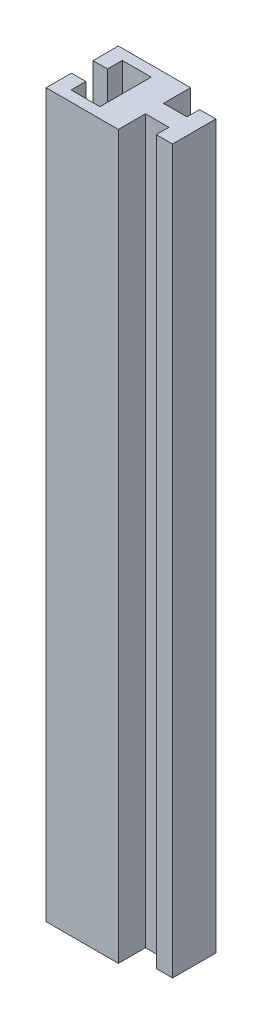
ISO-10303-21;
HEADER;
FILE_DESCRIPTION(('STEP AP214'),'2;1');
FILE_NAME('part.step','',(''),(''),'','','');
FILE_SCHEMA(('AUTOMOTIVE_DESIGN { 1 0 10303 214 1 1 1 1 }'));
ENDSEC;
DATA;
#1=APPLICATION_CONTEXT('core data for automotive mechanical design processes');
#2=APPLICATION_PROTOCOL_DEFINITION('international standard','automotive_design',2000,#1);
#3=PRODUCT_CONTEXT('',#1,'mechanical');
#4=PRODUCT('Part','Part','',(#3));
#5=PRODUCT_RELATED_PRODUCT_CATEGORY('part','',(#4));
#6=PRODUCT_DEFINITION_FORMATION('','',#4);
#7=PRODUCT_DEFINITION_CONTEXT('part definition',#1,'design');
#8=PRODUCT_DEFINITION('design','',#6,#7);
#9=PRODUCT_DEFINITION_SHAPE('','',#8);
#10=(LENGTH_UNIT() NAMED_UNIT(*) SI_UNIT(.MILLI.,.METRE.));
#11=(NAMED_UNIT(*) PLANE_ANGLE_UNIT() SI_UNIT($,.RADIAN.));
#12=(NAMED_UNIT(*) SI_UNIT($,.STERADIAN.) SOLID_ANGLE_UNIT());
#13=UNCERTAINTY_MEASURE_WITH_UNIT(LENGTH_MEASURE(1.E-05),#10,'distance_accuracy_value','');
#14=(GEOMETRIC_REPRESENTATION_CONTEXT(3) GLOBAL_UNCERTAINTY_ASSIGNED_CONTEXT((#13)) GLOBAL_UNIT_ASSIGNED_CONTEXT((#10,
#11,#12)) REPRESENTATION_CONTEXT('',''));
#15=CARTESIAN_POINT('',(0.,0.,0.));
#16=DIRECTION('',(0.,0.,1.));
#17=DIRECTION('',(1.,0.,0.));
#18=AXIS2_PLACEMENT_3D('',#15,#16,#17);
#19=CARTESIAN_POINT('',(-31.0085039636509,100.,17.4948512109097));
#20=DIRECTION('',(1.,0.,0.));
#21=DIRECTION('',(0.,0.,-1.));
#22=AXIS2_PLACEMENT_3D('',#19,#20,#21);
#23=PLANE('',#22);
#24=DIRECTION('',(0.,0.,1.));
#25=VECTOR('',#24,1.);
#26=CARTESIAN_POINT('',(-31.0085039636509,0.,17.4948512109097));
#27=LINE('',#26,#25);
#28=CARTESIAN_POINT('',(-31.0085039636509,0.,7.49485121090974));
#29=VERTEX_POINT('',#28);
#30=CARTESIAN_POINT('',(-31.0085039636509,0.,10.9948512109097));
#31=VERTEX_POINT('',#30);
#32=EDGE_CURVE('E192',#29,#31,#27,.T.);
#33=ORIENTED_EDGE('',*,*,#32,.T.);
#34=DIRECTION('',(0.,1.,0.));
#35=VECTOR('',#34,1.);
#36=CARTESIAN_POINT('',(-31.0085039636509,0.,10.9948512109097));
#37=LINE('',#36,#35);
#38=CARTESIAN_POINT('',(-31.0085039636509,100.,10.9948512109097));
#39=VERTEX_POINT('',#38);
#40=EDGE_CURVE('E255',#31,#39,#37,.T.);
#41=ORIENTED_EDGE('',*,*,#40,.T.);
#42=DIRECTION('',(0.,0.,1.));
#43=VECTOR('',#42,1.);
#44=CARTESIAN_POINT('',(-31.0085039636509,100.,17.4948512109097));
#45=LINE('',#44,#43);
#46=CARTESIAN_POINT('',(-31.0085039636509,100.,7.49485121090974));
#47=VERTEX_POINT('',#46);
#48=EDGE_CURVE('E281',#47,#39,#45,.T.);
#49=ORIENTED_EDGE('',*,*,#48,.F.);
#50=DIRECTION('',(0.,-1.,0.));
#51=VECTOR('',#50,1.);
#52=CARTESIAN_POINT('',(-31.0085039636509,100.,7.49485121090974));
#53=LINE('',#52,#51);
#54=EDGE_CURVE('E209',#47,#29,#53,.T.);
#55=ORIENTED_EDGE('',*,*,#54,.T.);
#56=EDGE_LOOP('',(#33,#41,#49,#55));
#57=FACE_BOUND('',#56,.T.);
#58=ADVANCED_FACE('F33',(#57),#23,.F.);
#59=CARTESIAN_POINT('',(-21.0085039636509,100.,17.4948512109097));
#60=DIRECTION('',(-1.,0.,0.));
#61=DIRECTION('',(0.,0.,1.));
#62=AXIS2_PLACEMENT_3D('',#59,#60,#61);
#63=PLANE('',#62);
#64=DIRECTION('',(0.,1.,0.));
#65=VECTOR('',#64,1.);
#66=CARTESIAN_POINT('',(-21.0085039636509,0.,11.2448512109097));
#67=LINE('',#66,#65);
#68=CARTESIAN_POINT('',(-21.0085039636509,0.,11.2448512109097));
#69=VERTEX_POINT('',#68);
#70=CARTESIAN_POINT('',(-21.0085039636509,100.,11.2448512109097));
#71=VERTEX_POINT('',#70);
#72=EDGE_CURVE('E193',#69,#71,#67,.T.);
#73=ORIENTED_EDGE('',*,*,#72,.F.);
#74=DIRECTION('',(0.,0.,-1.));
#75=VECTOR('',#74,1.);
#76=CARTESIAN_POINT('',(-21.0085039636509,0.,17.4948512109097));
#77=LINE('',#76,#75);
#78=CARTESIAN_POINT('',(-21.0085039636509,0.,7.49485121090974));
#79=VERTEX_POINT('',#78);
#80=EDGE_CURVE('E203',#69,#79,#77,.T.);
#81=ORIENTED_EDGE('',*,*,#80,.T.);
#82=DIRECTION('',(0.,-1.,0.));
#83=VECTOR('',#82,1.);
#84=CARTESIAN_POINT('',(-21.0085039636509,100.,7.49485121090974));
#85=LINE('',#84,#83);
#86=CARTESIAN_POINT('',(-21.0085039636509,100.,7.49485121090974));
#87=VERTEX_POINT('',#86);
#88=EDGE_CURVE('E212',#87,#79,#85,.T.);
#89=ORIENTED_EDGE('',*,*,#88,.F.);
#90=DIRECTION('',(0.,0.,-1.));
#91=VECTOR('',#90,1.);
#92=CARTESIAN_POINT('',(-21.0085039636509,100.,17.4948512109097));
#93=LINE('',#92,#91);
#94=EDGE_CURVE('E285',#71,#87,#93,.T.);
#95=ORIENTED_EDGE('',*,*,#94,.F.);
#96=EDGE_LOOP('',(#73,#81,#89,#95));
#97=FACE_BOUND('',#96,.T.);
#98=ADVANCED_FACE('F295',(#97),#63,.F.);
#99=CARTESIAN_POINT('',(-31.0085039636509,100.,13.9948512109097));
#100=VERTEX_POINT('',#99);
#101=CARTESIAN_POINT('',(-31.0085039636509,100.,17.4948512109097));
#102=VERTEX_POINT('',#101);
#103=EDGE_CURVE('E185',#100,#102,#45,.T.);
#104=ORIENTED_EDGE('',*,*,#103,.F.);
#105=DIRECTION('',(0.,1.,0.));
#106=VECTOR('',#105,1.);
#107=CARTESIAN_POINT('',(-31.0085039636509,0.,13.9948512109097));
#108=LINE('',#107,#106);
#109=CARTESIAN_POINT('',(-31.0085039636509,0.,13.9948512109097));
#110=VERTEX_POINT('',#109);
#111=EDGE_CURVE('E173',#110,#100,#108,.T.);
#112=ORIENTED_EDGE('',*,*,#111,.F.);
#113=CARTESIAN_POINT('',(-31.0085039636509,0.,17.4948512109097));
#114=VERTEX_POINT('',#113);
#115=EDGE_CURVE('E183',#110,#114,#27,.T.);
#116=ORIENTED_EDGE('',*,*,#115,.T.);
#117=DIRECTION('',(0.,-1.,0.));
#118=VECTOR('',#117,1.);
#119=CARTESIAN_POINT('',(-31.0085039636509,100.,17.4948512109097));
#120=LINE('',#119,#118);
#121=EDGE_CURVE('E11',#102,#114,#120,.T.);
#122=ORIENTED_EDGE('',*,*,#121,.F.);
#123=EDGE_LOOP('',(#104,#112,#116,#122));
#124=FACE_BOUND('',#123,.T.);
#125=ADVANCED_FACE('F35',(#124),#23,.F.);
#126=CARTESIAN_POINT('',(-31.0085039636509,100.,17.4948512109097));
#127=DIRECTION('',(0.,0.,-1.));
#128=DIRECTION('',(-1.,0.,0.));
#129=AXIS2_PLACEMENT_3D('',#126,#127,#128);
#130=PLANE('',#129);
#131=DIRECTION('',(1.,0.,0.));
#132=VECTOR('',#131,1.);
#133=CARTESIAN_POINT('',(-31.0085039636509,0.,17.4948512109097));
#134=LINE('',#133,#132);
#135=CARTESIAN_POINT('',(-21.0085039636509,0.,17.4948512109097));
#136=VERTEX_POINT('',#135);
#137=EDGE_CURVE('E191',#114,#136,#134,.T.);
#138=ORIENTED_EDGE('',*,*,#137,.T.);
#139=DIRECTION('',(0.,-1.,0.));
#140=VECTOR('',#139,1.);
#141=CARTESIAN_POINT('',(-21.0085039636509,100.,17.4948512109097));
#142=LINE('',#141,#140);
#143=CARTESIAN_POINT('',(-21.0085039636509,100.,17.4948512109097));
#144=VERTEX_POINT('',#143);
#145=EDGE_CURVE('E41',#144,#136,#142,.T.);
#146=ORIENTED_EDGE('',*,*,#145,.F.);
#147=DIRECTION('',(1.,0.,0.));
#148=VECTOR('',#147,1.);
#149=CARTESIAN_POINT('',(-31.0085039636509,100.,17.4948512109097));
#150=LINE('',#149,#148);
#151=EDGE_CURVE('E284',#102,#144,#150,.T.);
#152=ORIENTED_EDGE('',*,*,#151,.F.);
#153=ORIENTED_EDGE('',*,*,#121,.T.);
#154=EDGE_LOOP('',(#138,#146,#152,#153));
#155=FACE_BOUND('',#154,.T.);
#156=ADVANCED_FACE('F384',(#155),#130,.F.);
#157=CARTESIAN_POINT('',(-21.0085039636509,0.,13.7448512109097));
#158=VERTEX_POINT('',#157);
#159=EDGE_CURVE('E204',#136,#158,#77,.T.);
#160=ORIENTED_EDGE('',*,*,#159,.T.);
#161=DIRECTION('',(0.,1.,0.));
#162=VECTOR('',#161,1.);
#163=CARTESIAN_POINT('',(-21.0085039636509,0.,13.7448512109097));
#164=LINE('',#163,#162);
#165=CARTESIAN_POINT('',(-21.0085039636509,100.,13.7448512109097));
#166=VERTEX_POINT('',#165);
#167=EDGE_CURVE('E252',#158,#166,#164,.T.);
#168=ORIENTED_EDGE('',*,*,#167,.T.);
#169=EDGE_CURVE('E220',#144,#166,#93,.T.);
#170=ORIENTED_EDGE('',*,*,#169,.F.);
#171=ORIENTED_EDGE('',*,*,#145,.T.);
#172=EDGE_LOOP('',(#160,#168,#170,#171));
#173=FACE_BOUND('',#172,.T.);
#174=ADVANCED_FACE('F218',(#173),#63,.F.);
#175=CARTESIAN_POINT('',(-31.0085039636509,100.,7.49485121090974));
#176=DIRECTION('',(0.,0.,1.));
#177=DIRECTION('',(1.,0.,0.));
#178=AXIS2_PLACEMENT_3D('',#175,#176,#177);
#179=PLANE('',#178);
#180=DIRECTION('',(-1.,0.,0.));
#181=VECTOR('',#180,1.);
#182=CARTESIAN_POINT('',(-31.0085039636509,0.,7.49485121090974));
#183=LINE('',#182,#181);
#184=EDGE_CURVE('E207',#79,#29,#183,.T.);
#185=ORIENTED_EDGE('',*,*,#184,.T.);
#186=ORIENTED_EDGE('',*,*,#54,.F.);
#187=DIRECTION('',(-1.,0.,0.));
#188=VECTOR('',#187,1.);
#189=CARTESIAN_POINT('',(-31.0085039636509,100.,7.49485121090974));
#190=LINE('',#189,#188);
#191=EDGE_CURVE('E200',#87,#47,#190,.T.);
#192=ORIENTED_EDGE('',*,*,#191,.F.);
#193=ORIENTED_EDGE('',*,*,#88,.T.);
#194=EDGE_LOOP('',(#185,#186,#192,#193));
#195=FACE_BOUND('',#194,.T.);
#196=ADVANCED_FACE('F299',(#195),#179,.F.);
#197=CARTESIAN_POINT('',(0.,100.,0.));
#198=DIRECTION('',(0.,-1.,0.));
#199=DIRECTION('',(0.,0.,-1.));
#200=AXIS2_PLACEMENT_3D('',#197,#198,#199);
#201=PLANE('',#200);
#202=ORIENTED_EDGE('',*,*,#48,.T.);
#203=DIRECTION('',(-1.,0.,0.));
#204=VECTOR('',#203,1.);
#205=CARTESIAN_POINT('',(-29.0085039636509,100.,10.9948512109097));
#206=LINE('',#205,#204);
#207=CARTESIAN_POINT('',(-29.0085039636509,100.,10.9948512109097));
#208=VERTEX_POINT('',#207);
#209=EDGE_CURVE('E178',#208,#39,#206,.T.);
#210=ORIENTED_EDGE('',*,*,#209,.F.);
#211=DIRECTION('',(0.,0.,1.));
#212=VECTOR('',#211,1.);
#213=CARTESIAN_POINT('',(-29.0085039636509,100.,8.94485121090974));
#214=LINE('',#213,#212);
#215=CARTESIAN_POINT('',(-29.0085039636509,100.,8.94485121090974));
#216=VERTEX_POINT('',#215);
#217=EDGE_CURVE('E308',#216,#208,#214,.T.);
#218=ORIENTED_EDGE('',*,*,#217,.F.);
#219=DIRECTION('',(-1.,0.,0.));
#220=VECTOR('',#219,1.);
#221=CARTESIAN_POINT('',(-25.0085039636509,100.,8.94485121090974));
#222=LINE('',#221,#220);
#223=CARTESIAN_POINT('',(-25.0085039636509,100.,8.94485121090974));
#224=VERTEX_POINT('',#223);
#225=EDGE_CURVE('E311',#224,#216,#222,.T.);
#226=ORIENTED_EDGE('',*,*,#225,.F.);
#227=DIRECTION('',(0.,0.,-1.));
#228=VECTOR('',#227,1.);
#229=CARTESIAN_POINT('',(-25.0085039636509,100.,16.0448512109097));
#230=LINE('',#229,#228);
#231=CARTESIAN_POINT('',(-25.0085039636509,100.,16.0448512109097));
#232=VERTEX_POINT('',#231);
#233=EDGE_CURVE('E336',#232,#224,#230,.T.);
#234=ORIENTED_EDGE('',*,*,#233,.F.);
#235=DIRECTION('',(1.,0.,0.));
#236=VECTOR('',#235,1.);
#237=CARTESIAN_POINT('',(-29.0085039636509,100.,16.0448512109097));
#238=LINE('',#237,#236);
#239=CARTESIAN_POINT('',(-29.0085039636509,100.,16.0448512109097));
#240=VERTEX_POINT('',#239);
#241=EDGE_CURVE('E334',#240,#232,#238,.T.);
#242=ORIENTED_EDGE('',*,*,#241,.F.);
#243=DIRECTION('',(0.,0.,1.));
#244=VECTOR('',#243,1.);
#245=CARTESIAN_POINT('',(-29.0085039636509,100.,13.9948512109097));
#246=LINE('',#245,#244);
#247=CARTESIAN_POINT('',(-29.0085039636509,100.,13.9948512109097));
#248=VERTEX_POINT('',#247);
#249=EDGE_CURVE('E328',#248,#240,#246,.T.);
#250=ORIENTED_EDGE('',*,*,#249,.F.);
#251=DIRECTION('',(1.,0.,0.));
#252=VECTOR('',#251,1.);
#253=CARTESIAN_POINT('',(-31.0085039636509,100.,13.9948512109097));
#254=LINE('',#253,#252);
#255=EDGE_CURVE('E330',#100,#248,#254,.T.);
#256=ORIENTED_EDGE('',*,*,#255,.F.);
#257=ORIENTED_EDGE('',*,*,#103,.T.);
#258=ORIENTED_EDGE('',*,*,#151,.T.);
#259=ORIENTED_EDGE('',*,*,#169,.T.);
#260=DIRECTION('',(1.,0.,0.));
#261=VECTOR('',#260,1.);
#262=CARTESIAN_POINT('',(-17.7585039636509,100.,13.7448512109097));
#263=LINE('',#262,#261);
#264=CARTESIAN_POINT('',(-17.7585039636509,100.,13.7448512109097));
#265=VERTEX_POINT('',#264);
#266=EDGE_CURVE('E56',#166,#265,#263,.T.);
#267=ORIENTED_EDGE('',*,*,#266,.T.);
#268=DIRECTION('',(0.,0.,1.));
#269=VECTOR('',#268,1.);
#270=CARTESIAN_POINT('',(-17.7585039636509,100.,15.4948512109097));
#271=LINE('',#270,#269);
#272=CARTESIAN_POINT('',(-17.7585039636509,100.,15.4948512109097));
#273=VERTEX_POINT('',#272);
#274=EDGE_CURVE('E254',#265,#273,#271,.T.);
#275=ORIENTED_EDGE('',*,*,#274,.T.);
#276=DIRECTION('',(1.,0.,0.));
#277=VECTOR('',#276,1.);
#278=CARTESIAN_POINT('',(-15.5085039636509,100.,15.4948512109097));
#279=LINE('',#278,#277);
#280=CARTESIAN_POINT('',(-15.5085039636509,100.,15.4948512109097));
#281=VERTEX_POINT('',#280);
#282=EDGE_CURVE('E258',#273,#281,#279,.T.);
#283=ORIENTED_EDGE('',*,*,#282,.T.);
#284=DIRECTION('',(0.,0.,-1.));
#285=VECTOR('',#284,1.);
#286=CARTESIAN_POINT('',(-15.5085039636509,100.,9.49485121090974));
#287=LINE('',#286,#285);
#288=CARTESIAN_POINT('',(-15.5085039636509,100.,9.49485121090974));
#289=VERTEX_POINT('',#288);
#290=EDGE_CURVE('E261',#281,#289,#287,.T.);
#291=ORIENTED_EDGE('',*,*,#290,.T.);
#292=DIRECTION('',(-1.,0.,0.));
#293=VECTOR('',#292,1.);
#294=CARTESIAN_POINT('',(-17.7585039636509,100.,9.49485121090974));
#295=LINE('',#294,#293);
#296=CARTESIAN_POINT('',(-17.7585039636509,100.,9.49485121090974));
#297=VERTEX_POINT('',#296);
#298=EDGE_CURVE('E264',#289,#297,#295,.T.);
#299=ORIENTED_EDGE('',*,*,#298,.T.);
#300=DIRECTION('',(0.,0.,1.));
#301=VECTOR('',#300,1.);
#302=CARTESIAN_POINT('',(-17.7585039636509,100.,11.2448512109097));
#303=LINE('',#302,#301);
#304=CARTESIAN_POINT('',(-17.7585039636509,100.,11.2448512109097));
#305=VERTEX_POINT('',#304);
#306=EDGE_CURVE('E235',#297,#305,#303,.T.);
#307=ORIENTED_EDGE('',*,*,#306,.T.);
#308=DIRECTION('',(-1.,0.,0.));
#309=VECTOR('',#308,1.);
#310=CARTESIAN_POINT('',(-21.0085039636509,100.,11.2448512109097));
#311=LINE('',#310,#309);
#312=EDGE_CURVE('E230',#305,#71,#311,.T.);
#313=ORIENTED_EDGE('',*,*,#312,.T.);
#314=ORIENTED_EDGE('',*,*,#94,.T.);
#315=ORIENTED_EDGE('',*,*,#191,.T.);
#316=EDGE_LOOP('',(#202,#210,#218,#226,#234,#242,#250,#256,#257,#258,#259,#267,#275,#283,#291,
#299,#307,#313,#314,#315));
#317=FACE_BOUND('',#316,.T.);
#318=ADVANCED_FACE('F289',(#317),#201,.F.);
#319=CARTESIAN_POINT('',(0.,0.,0.));
#320=DIRECTION('',(0.,-1.,0.));
#321=DIRECTION('',(0.,0.,-1.));
#322=AXIS2_PLACEMENT_3D('',#319,#320,#321);
#323=PLANE('',#322);
#324=DIRECTION('',(-1.,0.,0.));
#325=VECTOR('',#324,1.);
#326=CARTESIAN_POINT('',(-29.0085039636509,0.,10.9948512109097));
#327=LINE('',#326,#325);
#328=CARTESIAN_POINT('',(-29.0085039636509,0.,10.9948512109097));
#329=VERTEX_POINT('',#328);
#330=EDGE_CURVE('E186',#329,#31,#327,.T.);
#331=ORIENTED_EDGE('',*,*,#330,.T.);
#332=ORIENTED_EDGE('',*,*,#32,.F.);
#333=ORIENTED_EDGE('',*,*,#184,.F.);
#334=ORIENTED_EDGE('',*,*,#80,.F.);
#335=DIRECTION('',(-1.,0.,0.));
#336=VECTOR('',#335,1.);
#337=CARTESIAN_POINT('',(-21.0085039636509,0.,11.2448512109097));
#338=LINE('',#337,#336);
#339=CARTESIAN_POINT('',(-17.7585039636509,0.,11.2448512109097));
#340=VERTEX_POINT('',#339);
#341=EDGE_CURVE('E250',#340,#69,#338,.T.);
#342=ORIENTED_EDGE('',*,*,#341,.F.);
#343=DIRECTION('',(0.,0.,1.));
#344=VECTOR('',#343,1.);
#345=CARTESIAN_POINT('',(-17.7585039636509,0.,11.2448512109097));
#346=LINE('',#345,#344);
#347=CARTESIAN_POINT('',(-17.7585039636509,0.,9.49485121090974));
#348=VERTEX_POINT('',#347);
#349=EDGE_CURVE('E247',#348,#340,#346,.T.);
#350=ORIENTED_EDGE('',*,*,#349,.F.);
#351=DIRECTION('',(-1.,0.,0.));
#352=VECTOR('',#351,1.);
#353=CARTESIAN_POINT('',(-17.7585039636509,0.,9.49485121090974));
#354=LINE('',#353,#352);
#355=CARTESIAN_POINT('',(-15.5085039636509,0.,9.49485121090974));
#356=VERTEX_POINT('',#355);
#357=EDGE_CURVE('E244',#356,#348,#354,.T.);
#358=ORIENTED_EDGE('',*,*,#357,.F.);
#359=DIRECTION('',(0.,0.,-1.));
#360=VECTOR('',#359,1.);
#361=CARTESIAN_POINT('',(-15.5085039636509,0.,9.49485121090974));
#362=LINE('',#361,#360);
#363=CARTESIAN_POINT('',(-15.5085039636509,0.,15.4948512109097));
#364=VERTEX_POINT('',#363);
#365=EDGE_CURVE('E241',#364,#356,#362,.T.);
#366=ORIENTED_EDGE('',*,*,#365,.F.);
#367=DIRECTION('',(1.,0.,0.));
#368=VECTOR('',#367,1.);
#369=CARTESIAN_POINT('',(-15.5085039636509,0.,15.4948512109097));
#370=LINE('',#369,#368);
#371=CARTESIAN_POINT('',(-17.7585039636509,0.,15.4948512109097));
#372=VERTEX_POINT('',#371);
#373=EDGE_CURVE('E232',#372,#364,#370,.T.);
#374=ORIENTED_EDGE('',*,*,#373,.F.);
#375=DIRECTION('',(0.,0.,1.));
#376=VECTOR('',#375,1.);
#377=CARTESIAN_POINT('',(-17.7585039636509,0.,15.4948512109097));
#378=LINE('',#377,#376);
#379=CARTESIAN_POINT('',(-17.7585039636509,0.,13.7448512109097));
#380=VERTEX_POINT('',#379);
#381=EDGE_CURVE('E229',#380,#372,#378,.T.);
#382=ORIENTED_EDGE('',*,*,#381,.F.);
#383=DIRECTION('',(1.,0.,0.));
#384=VECTOR('',#383,1.);
#385=CARTESIAN_POINT('',(-17.7585039636509,0.,13.7448512109097));
#386=LINE('',#385,#384);
#387=EDGE_CURVE('E226',#158,#380,#386,.T.);
#388=ORIENTED_EDGE('',*,*,#387,.F.);
#389=ORIENTED_EDGE('',*,*,#159,.F.);
#390=ORIENTED_EDGE('',*,*,#137,.F.);
#391=ORIENTED_EDGE('',*,*,#115,.F.);
#392=DIRECTION('',(1.,0.,0.));
#393=VECTOR('',#392,1.);
#394=CARTESIAN_POINT('',(-31.0085039636509,0.,13.9948512109097));
#395=LINE('',#394,#393);
#396=CARTESIAN_POINT('',(-29.0085039636509,0.,13.9948512109097));
#397=VERTEX_POINT('',#396);
#398=EDGE_CURVE('E169',#110,#397,#395,.T.);
#399=ORIENTED_EDGE('',*,*,#398,.T.);
#400=DIRECTION('',(0.,0.,1.));
#401=VECTOR('',#400,1.);
#402=CARTESIAN_POINT('',(-29.0085039636509,0.,13.9948512109097));
#403=LINE('',#402,#401);
#404=CARTESIAN_POINT('',(-29.0085039636509,0.,16.0448512109097));
#405=VERTEX_POINT('',#404);
#406=EDGE_CURVE('E48',#397,#405,#403,.T.);
#407=ORIENTED_EDGE('',*,*,#406,.T.);
#408=DIRECTION('',(1.,0.,0.));
#409=VECTOR('',#408,1.);
#410=CARTESIAN_POINT('',(-29.0085039636509,0.,16.0448512109097));
#411=LINE('',#410,#409);
#412=CARTESIAN_POINT('',(-25.0085039636509,0.,16.0448512109097));
#413=VERTEX_POINT('',#412);
#414=EDGE_CURVE('E355',#405,#413,#411,.T.);
#415=ORIENTED_EDGE('',*,*,#414,.T.);
#416=DIRECTION('',(0.,0.,-1.));
#417=VECTOR('',#416,1.);
#418=CARTESIAN_POINT('',(-25.0085039636509,0.,16.0448512109097));
#419=LINE('',#418,#417);
#420=CARTESIAN_POINT('',(-25.0085039636509,0.,8.94485121090974));
#421=VERTEX_POINT('',#420);
#422=EDGE_CURVE('E350',#413,#421,#419,.T.);
#423=ORIENTED_EDGE('',*,*,#422,.T.);
#424=DIRECTION('',(-1.,0.,0.));
#425=VECTOR('',#424,1.);
#426=CARTESIAN_POINT('',(-25.0085039636509,0.,8.94485121090974));
#427=LINE('',#426,#425);
#428=CARTESIAN_POINT('',(-29.0085039636509,0.,8.94485121090974));
#429=VERTEX_POINT('',#428);
#430=EDGE_CURVE('E360',#421,#429,#427,.T.);
#431=ORIENTED_EDGE('',*,*,#430,.T.);
#432=DIRECTION('',(0.,0.,1.));
#433=VECTOR('',#432,1.);
#434=CARTESIAN_POINT('',(-29.0085039636509,0.,8.94485121090974));
#435=LINE('',#434,#433);
#436=EDGE_CURVE('E363',#429,#329,#435,.T.);
#437=ORIENTED_EDGE('',*,*,#436,.T.);
#438=EDGE_LOOP('',(#331,#332,#333,#334,#342,#350,#358,#366,#374,#382,#388,#389,#390,#391,#399,
#407,#415,#423,#431,#437));
#439=FACE_BOUND('',#438,.T.);
#440=ADVANCED_FACE('F189',(#439),#323,.T.);
#441=CARTESIAN_POINT('',(-21.0085039636509,0.,11.2448512109097));
#442=DIRECTION('',(0.,0.,-1.));
#443=DIRECTION('',(-1.,0.,0.));
#444=AXIS2_PLACEMENT_3D('',#441,#442,#443);
#445=PLANE('',#444);
#446=ORIENTED_EDGE('',*,*,#312,.F.);
#447=DIRECTION('',(0.,1.,0.));
#448=VECTOR('',#447,1.);
#449=CARTESIAN_POINT('',(-17.7585039636509,0.,11.2448512109097));
#450=LINE('',#449,#448);
#451=EDGE_CURVE('E196',#340,#305,#450,.T.);
#452=ORIENTED_EDGE('',*,*,#451,.F.);
#453=ORIENTED_EDGE('',*,*,#341,.T.);
#454=ORIENTED_EDGE('',*,*,#72,.T.);
#455=EDGE_LOOP('',(#446,#452,#453,#454));
#456=FACE_BOUND('',#455,.T.);
#457=ADVANCED_FACE('F396',(#456),#445,.T.);
#458=CARTESIAN_POINT('',(-17.7585039636509,0.,11.2448512109097));
#459=DIRECTION('',(-1.,0.,0.));
#460=DIRECTION('',(0.,0.,1.));
#461=AXIS2_PLACEMENT_3D('',#458,#459,#460);
#462=PLANE('',#461);
#463=ORIENTED_EDGE('',*,*,#306,.F.);
#464=DIRECTION('',(0.,1.,0.));
#465=VECTOR('',#464,1.);
#466=CARTESIAN_POINT('',(-17.7585039636509,0.,9.49485121090974));
#467=LINE('',#466,#465);
#468=EDGE_CURVE('E270',#348,#297,#467,.T.);
#469=ORIENTED_EDGE('',*,*,#468,.F.);
#470=ORIENTED_EDGE('',*,*,#349,.T.);
#471=ORIENTED_EDGE('',*,*,#451,.T.);
#472=EDGE_LOOP('',(#463,#469,#470,#471));
#473=FACE_BOUND('',#472,.T.);
#474=ADVANCED_FACE('F416',(#473),#462,.T.);
#475=CARTESIAN_POINT('',(-17.7585039636509,0.,9.49485121090974));
#476=DIRECTION('',(0.,0.,-1.));
#477=DIRECTION('',(-1.,0.,0.));
#478=AXIS2_PLACEMENT_3D('',#475,#476,#477);
#479=PLANE('',#478);
#480=ORIENTED_EDGE('',*,*,#298,.F.);
#481=DIRECTION('',(0.,1.,0.));
#482=VECTOR('',#481,1.);
#483=CARTESIAN_POINT('',(-15.5085039636509,0.,9.49485121090974));
#484=LINE('',#483,#482);
#485=EDGE_CURVE('E272',#356,#289,#484,.T.);
#486=ORIENTED_EDGE('',*,*,#485,.F.);
#487=ORIENTED_EDGE('',*,*,#357,.T.);
#488=ORIENTED_EDGE('',*,*,#468,.T.);
#489=EDGE_LOOP('',(#480,#486,#487,#488));
#490=FACE_BOUND('',#489,.T.);
#491=ADVANCED_FACE('F412',(#490),#479,.T.);
#492=CARTESIAN_POINT('',(-15.5085039636509,0.,9.49485121090974));
#493=DIRECTION('',(1.,0.,0.));
#494=DIRECTION('',(0.,0.,-1.));
#495=AXIS2_PLACEMENT_3D('',#492,#493,#494);
#496=PLANE('',#495);
#497=ORIENTED_EDGE('',*,*,#290,.F.);
#498=DIRECTION('',(0.,1.,0.));
#499=VECTOR('',#498,1.);
#500=CARTESIAN_POINT('',(-15.5085039636509,0.,15.4948512109097));
#501=LINE('',#500,#499);
#502=EDGE_CURVE('E274',#364,#281,#501,.T.);
#503=ORIENTED_EDGE('',*,*,#502,.F.);
#504=ORIENTED_EDGE('',*,*,#365,.T.);
#505=ORIENTED_EDGE('',*,*,#485,.T.);
#506=EDGE_LOOP('',(#497,#503,#504,#505));
#507=FACE_BOUND('',#506,.T.);
#508=ADVANCED_FACE('F408',(#507),#496,.T.);
#509=CARTESIAN_POINT('',(-15.5085039636509,0.,15.4948512109097));
#510=DIRECTION('',(0.,0.,1.));
#511=DIRECTION('',(1.,0.,0.));
#512=AXIS2_PLACEMENT_3D('',#509,#510,#511);
#513=PLANE('',#512);
#514=ORIENTED_EDGE('',*,*,#282,.F.);
#515=DIRECTION('',(0.,1.,0.));
#516=VECTOR('',#515,1.);
#517=CARTESIAN_POINT('',(-17.7585039636509,0.,15.4948512109097));
#518=LINE('',#517,#516);
#519=EDGE_CURVE('E276',#372,#273,#518,.T.);
#520=ORIENTED_EDGE('',*,*,#519,.F.);
#521=ORIENTED_EDGE('',*,*,#373,.T.);
#522=ORIENTED_EDGE('',*,*,#502,.T.);
#523=EDGE_LOOP('',(#514,#520,#521,#522));
#524=FACE_BOUND('',#523,.T.);
#525=ADVANCED_FACE('F404',(#524),#513,.T.);
#526=CARTESIAN_POINT('',(-17.7585039636509,0.,15.4948512109097));
#527=DIRECTION('',(-1.,0.,0.));
#528=DIRECTION('',(0.,0.,1.));
#529=AXIS2_PLACEMENT_3D('',#526,#527,#528);
#530=PLANE('',#529);
#531=ORIENTED_EDGE('',*,*,#274,.F.);
#532=DIRECTION('',(0.,1.,0.));
#533=VECTOR('',#532,1.);
#534=CARTESIAN_POINT('',(-17.7585039636509,0.,13.7448512109097));
#535=LINE('',#534,#533);
#536=EDGE_CURVE('E278',#380,#265,#535,.T.);
#537=ORIENTED_EDGE('',*,*,#536,.F.);
#538=ORIENTED_EDGE('',*,*,#381,.T.);
#539=ORIENTED_EDGE('',*,*,#519,.T.);
#540=EDGE_LOOP('',(#531,#537,#538,#539));
#541=FACE_BOUND('',#540,.T.);
#542=ADVANCED_FACE('F401',(#541),#530,.T.);
#543=CARTESIAN_POINT('',(-17.7585039636509,0.,13.7448512109097));
#544=DIRECTION('',(0.,0.,1.));
#545=DIRECTION('',(1.,0.,0.));
#546=AXIS2_PLACEMENT_3D('',#543,#544,#545);
#547=PLANE('',#546);
#548=ORIENTED_EDGE('',*,*,#266,.F.);
#549=ORIENTED_EDGE('',*,*,#167,.F.);
#550=ORIENTED_EDGE('',*,*,#387,.T.);
#551=ORIENTED_EDGE('',*,*,#536,.T.);
#552=EDGE_LOOP('',(#548,#549,#550,#551));
#553=FACE_BOUND('',#552,.T.);
#554=ADVANCED_FACE('F376',(#553),#547,.T.);
#555=CARTESIAN_POINT('',(-29.0085039636509,0.,10.9948512109097));
#556=DIRECTION('',(0.,0.,-1.));
#557=DIRECTION('',(-1.,0.,0.));
#558=AXIS2_PLACEMENT_3D('',#555,#556,#557);
#559=PLANE('',#558);
#560=ORIENTED_EDGE('',*,*,#209,.T.);
#561=ORIENTED_EDGE('',*,*,#40,.F.);
#562=ORIENTED_EDGE('',*,*,#330,.F.);
#563=DIRECTION('',(0.,1.,0.));
#564=VECTOR('',#563,1.);
#565=CARTESIAN_POINT('',(-29.0085039636509,0.,10.9948512109097));
#566=LINE('',#565,#564);
#567=EDGE_CURVE('E316',#329,#208,#566,.T.);
#568=ORIENTED_EDGE('',*,*,#567,.T.);
#569=EDGE_LOOP('',(#560,#561,#562,#568));
#570=FACE_BOUND('',#569,.T.);
#571=ADVANCED_FACE('F366',(#570),#559,.F.);
#572=CARTESIAN_POINT('',(-29.0085039636509,0.,8.94485121090974));
#573=DIRECTION('',(-1.,0.,0.));
#574=DIRECTION('',(0.,0.,1.));
#575=AXIS2_PLACEMENT_3D('',#572,#573,#574);
#576=PLANE('',#575);
#577=ORIENTED_EDGE('',*,*,#217,.T.);
#578=ORIENTED_EDGE('',*,*,#567,.F.);
#579=ORIENTED_EDGE('',*,*,#436,.F.);
#580=DIRECTION('',(0.,1.,0.));
#581=VECTOR('',#580,1.);
#582=CARTESIAN_POINT('',(-29.0085039636509,0.,8.94485121090974));
#583=LINE('',#582,#581);
#584=EDGE_CURVE('E318',#429,#216,#583,.T.);
#585=ORIENTED_EDGE('',*,*,#584,.T.);
#586=EDGE_LOOP('',(#577,#578,#579,#585));
#587=FACE_BOUND('',#586,.T.);
#588=ADVANCED_FACE('F368',(#587),#576,.F.);
#589=CARTESIAN_POINT('',(-25.0085039636509,0.,8.94485121090974));
#590=DIRECTION('',(0.,0.,-1.));
#591=DIRECTION('',(-1.,0.,0.));
#592=AXIS2_PLACEMENT_3D('',#589,#590,#591);
#593=PLANE('',#592);
#594=ORIENTED_EDGE('',*,*,#225,.T.);
#595=ORIENTED_EDGE('',*,*,#584,.F.);
#596=ORIENTED_EDGE('',*,*,#430,.F.);
#597=DIRECTION('',(0.,1.,0.));
#598=VECTOR('',#597,1.);
#599=CARTESIAN_POINT('',(-25.0085039636509,0.,8.94485121090974));
#600=LINE('',#599,#598);
#601=EDGE_CURVE('E320',#421,#224,#600,.T.);
#602=ORIENTED_EDGE('',*,*,#601,.T.);
#603=EDGE_LOOP('',(#594,#595,#596,#602));
#604=FACE_BOUND('',#603,.T.);
#605=ADVANCED_FACE('F343',(#604),#593,.F.);
#606=CARTESIAN_POINT('',(-25.0085039636509,0.,16.0448512109097));
#607=DIRECTION('',(1.,0.,0.));
#608=DIRECTION('',(0.,0.,-1.));
#609=AXIS2_PLACEMENT_3D('',#606,#607,#608);
#610=PLANE('',#609);
#611=ORIENTED_EDGE('',*,*,#233,.T.);
#612=ORIENTED_EDGE('',*,*,#601,.F.);
#613=ORIENTED_EDGE('',*,*,#422,.F.);
#614=DIRECTION('',(0.,1.,0.));
#615=VECTOR('',#614,1.);
#616=CARTESIAN_POINT('',(-25.0085039636509,0.,16.0448512109097));
#617=LINE('',#616,#615);
#618=EDGE_CURVE('E322',#413,#232,#617,.T.);
#619=ORIENTED_EDGE('',*,*,#618,.T.);
#620=EDGE_LOOP('',(#611,#612,#613,#619));
#621=FACE_BOUND('',#620,.T.);
#622=ADVANCED_FACE('F347',(#621),#610,.F.);
#623=CARTESIAN_POINT('',(-29.0085039636509,0.,16.0448512109097));
#624=DIRECTION('',(0.,0.,1.));
#625=DIRECTION('',(1.,0.,0.));
#626=AXIS2_PLACEMENT_3D('',#623,#624,#625);
#627=PLANE('',#626);
#628=ORIENTED_EDGE('',*,*,#241,.T.);
#629=ORIENTED_EDGE('',*,*,#618,.F.);
#630=ORIENTED_EDGE('',*,*,#414,.F.);
#631=DIRECTION('',(0.,1.,0.));
#632=VECTOR('',#631,1.);
#633=CARTESIAN_POINT('',(-29.0085039636509,0.,16.0448512109097));
#634=LINE('',#633,#632);
#635=EDGE_CURVE('E324',#405,#240,#634,.T.);
#636=ORIENTED_EDGE('',*,*,#635,.T.);
#637=EDGE_LOOP('',(#628,#629,#630,#636));
#638=FACE_BOUND('',#637,.T.);
#639=ADVANCED_FACE('F354',(#638),#627,.F.);
#640=CARTESIAN_POINT('',(-29.0085039636509,0.,13.9948512109097));
#641=DIRECTION('',(-1.,0.,0.));
#642=DIRECTION('',(0.,0.,1.));
#643=AXIS2_PLACEMENT_3D('',#640,#641,#642);
#644=PLANE('',#643);
#645=ORIENTED_EDGE('',*,*,#249,.T.);
#646=ORIENTED_EDGE('',*,*,#635,.F.);
#647=ORIENTED_EDGE('',*,*,#406,.F.);
#648=DIRECTION('',(0.,1.,0.));
#649=VECTOR('',#648,1.);
#650=CARTESIAN_POINT('',(-29.0085039636509,0.,13.9948512109097));
#651=LINE('',#650,#649);
#652=EDGE_CURVE('E175',#397,#248,#651,.T.);
#653=ORIENTED_EDGE('',*,*,#652,.T.);
#654=EDGE_LOOP('',(#645,#646,#647,#653));
#655=FACE_BOUND('',#654,.T.);
#656=ADVANCED_FACE('F326',(#655),#644,.F.);
#657=CARTESIAN_POINT('',(-31.0085039636509,0.,13.9948512109097));
#658=DIRECTION('',(0.,0.,1.));
#659=DIRECTION('',(1.,0.,0.));
#660=AXIS2_PLACEMENT_3D('',#657,#658,#659);
#661=PLANE('',#660);
#662=ORIENTED_EDGE('',*,*,#255,.T.);
#663=ORIENTED_EDGE('',*,*,#652,.F.);
#664=ORIENTED_EDGE('',*,*,#398,.F.);
#665=ORIENTED_EDGE('',*,*,#111,.T.);
#666=EDGE_LOOP('',(#662,#663,#664,#665));
#667=FACE_BOUND('',#666,.T.);
#668=ADVANCED_FACE('F172',(#667),#661,.F.);
#669=CLOSED_SHELL('',(#58,#98,#125,#156,#174,#196,#318,#440,#457,#474,#491,#508,#525,#542,#554,
#571,#588,#605,#622,#639,#656,#668));
#670=MANIFOLD_SOLID_BREP('B2',#669);
#671=ADVANCED_BREP_SHAPE_REPRESENTATION('',(#18,#670),#14);
#672=SHAPE_DEFINITION_REPRESENTATION(#9,#671);
ENDSEC;
END-ISO-10303-21;
